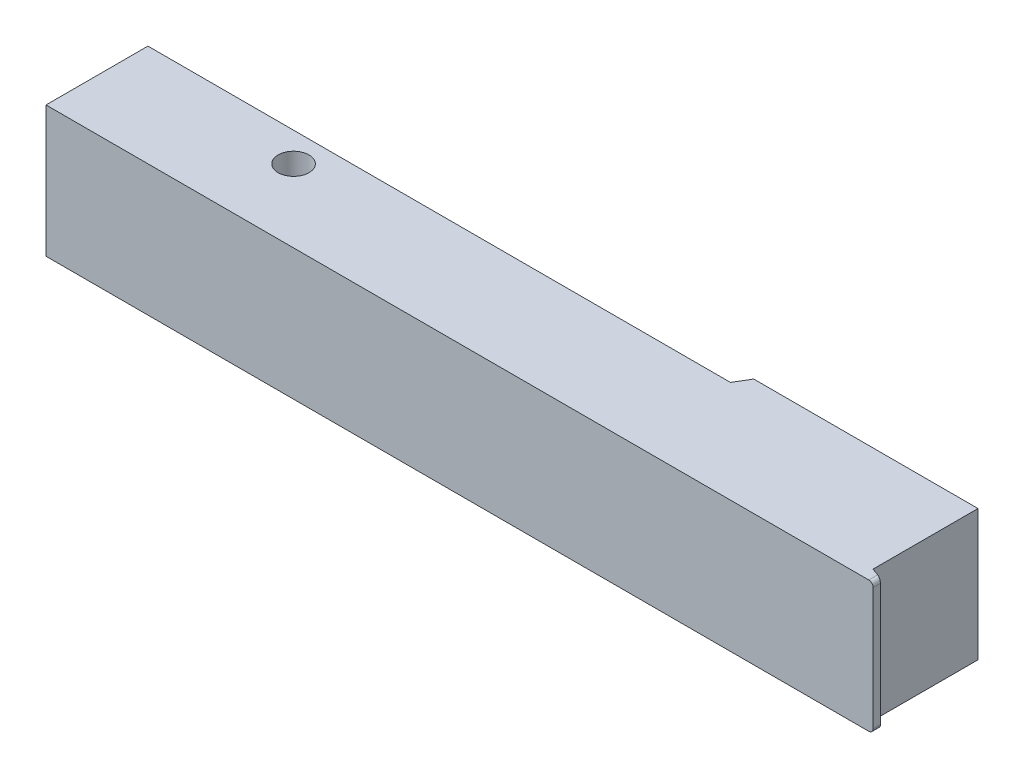
ISO-10303-21;
HEADER;
FILE_DESCRIPTION(('STEP AP214'),'2;1');
FILE_NAME('part.step','',(''),(''),'','','');
FILE_SCHEMA(('AUTOMOTIVE_DESIGN { 1 0 10303 214 1 1 1 1 }'));
ENDSEC;
DATA;
#1=APPLICATION_CONTEXT('core data for automotive mechanical design processes');
#2=APPLICATION_PROTOCOL_DEFINITION('international standard','automotive_design',2000,#1);
#3=PRODUCT_CONTEXT('',#1,'mechanical');
#4=PRODUCT('Part','Part','',(#3));
#5=PRODUCT_RELATED_PRODUCT_CATEGORY('part','',(#4));
#6=PRODUCT_DEFINITION_FORMATION('','',#4);
#7=PRODUCT_DEFINITION_CONTEXT('part definition',#1,'design');
#8=PRODUCT_DEFINITION('design','',#6,#7);
#9=PRODUCT_DEFINITION_SHAPE('','',#8);
#10=(LENGTH_UNIT() NAMED_UNIT(*) SI_UNIT(.MILLI.,.METRE.));
#11=(NAMED_UNIT(*) PLANE_ANGLE_UNIT() SI_UNIT($,.RADIAN.));
#12=(NAMED_UNIT(*) SI_UNIT($,.STERADIAN.) SOLID_ANGLE_UNIT());
#13=UNCERTAINTY_MEASURE_WITH_UNIT(LENGTH_MEASURE(1.E-05),#10,'distance_accuracy_value','');
#14=(GEOMETRIC_REPRESENTATION_CONTEXT(3) GLOBAL_UNCERTAINTY_ASSIGNED_CONTEXT((#13)) GLOBAL_UNIT_ASSIGNED_CONTEXT((#10,
#11,#12)) REPRESENTATION_CONTEXT('',''));
#15=CARTESIAN_POINT('',(0.,0.,0.));
#16=DIRECTION('',(0.,0.,1.));
#17=DIRECTION('',(1.,0.,0.));
#18=AXIS2_PLACEMENT_3D('',#15,#16,#17);
#19=CARTESIAN_POINT('',(0.,22.5,-20.));
#20=DIRECTION('',(0.,-1.,0.));
#21=DIRECTION('',(1.,0.,0.));
#22=AXIS2_PLACEMENT_3D('',#19,#20,#21);
#23=PLANE('',#22);
#24=CARTESIAN_POINT('',(30.,22.5,-12.5));
#25=DIRECTION('',(0.,1.,0.));
#26=DIRECTION('',(-1.,0.,0.));
#27=AXIS2_PLACEMENT_3D('',#24,#25,#26);
#28=CIRCLE('',#27,2.65);
#29=CARTESIAN_POINT('',(27.35,22.5,-12.5));
#30=VERTEX_POINT('',#29);
#31=EDGE_CURVE('E139',#30,#30,#28,.T.);
#32=ORIENTED_EDGE('',*,*,#31,.F.);
#33=EDGE_LOOP('',(#32));
#34=FACE_BOUND('',#33,.T.);
#35=DIRECTION('',(-0.514495755427527,0.,0.857492925712544));
#36=VECTOR('',#35,1.);
#37=CARTESIAN_POINT('',(74.6323529411764,22.5,24.7794117647059));
#38=LINE('',#37,#36);
#39=CARTESIAN_POINT('',(101.5,22.5,-20.));
#40=VERTEX_POINT('',#39);
#41=CARTESIAN_POINT('',(100.,22.5,-17.5));
#42=VERTEX_POINT('',#41);
#43=EDGE_CURVE('E59',#40,#42,#38,.T.);
#44=ORIENTED_EDGE('',*,*,#43,.T.);
#45=DIRECTION('',(-1.,0.,0.));
#46=VECTOR('',#45,1.);
#47=CARTESIAN_POINT('',(0.,22.5,-17.5));
#48=LINE('',#47,#46);
#49=CARTESIAN_POINT('',(0.,22.5,-17.5));
#50=VERTEX_POINT('',#49);
#51=EDGE_CURVE('E126',#42,#50,#48,.T.);
#52=ORIENTED_EDGE('',*,*,#51,.T.);
#53=DIRECTION('',(0.,0.,1.));
#54=VECTOR('',#53,1.);
#55=CARTESIAN_POINT('',(0.,22.5,-20.));
#56=LINE('',#55,#54);
#57=CARTESIAN_POINT('',(0.,22.5,0.));
#58=VERTEX_POINT('',#57);
#59=EDGE_CURVE('E175',#50,#58,#56,.T.);
#60=ORIENTED_EDGE('',*,*,#59,.T.);
#61=DIRECTION('',(1.,0.,0.));
#62=VECTOR('',#61,1.);
#63=CARTESIAN_POINT('',(0.,22.5,0.));
#64=LINE('',#63,#62);
#65=CARTESIAN_POINT('',(141.25,22.5,0.));
#66=VERTEX_POINT('',#65);
#67=EDGE_CURVE('E167',#58,#66,#64,.T.);
#68=ORIENTED_EDGE('',*,*,#67,.T.);
#69=DIRECTION('',(0.,0.,1.));
#70=VECTOR('',#69,1.);
#71=CARTESIAN_POINT('',(141.25,22.5,-1.24999999999999));
#72=LINE('',#71,#70);
#73=CARTESIAN_POINT('',(141.25,22.5,-1.52297767569964));
#74=VERTEX_POINT('',#73);
#75=EDGE_CURVE('E11',#66,#74,#72,.F.);
#76=ORIENTED_EDGE('',*,*,#75,.T.);
#77=DIRECTION('',(0.939692620785909,0.,0.342020143325667));
#78=VECTOR('',#77,1.);
#79=CARTESIAN_POINT('',(142.,22.5,-1.24999999999999));
#80=LINE('',#79,#78);
#81=CARTESIAN_POINT('',(140.,22.5,-1.97794046853239));
#82=VERTEX_POINT('',#81);
#83=EDGE_CURVE('E180',#74,#82,#80,.F.);
#84=ORIENTED_EDGE('',*,*,#83,.T.);
#85=DIRECTION('',(0.,0.,1.));
#86=VECTOR('',#85,1.);
#87=CARTESIAN_POINT('',(140.,22.5,-20.));
#88=LINE('',#87,#86);
#89=CARTESIAN_POINT('',(140.,22.5,-20.));
#90=VERTEX_POINT('',#89);
#91=EDGE_CURVE('E153',#90,#82,#88,.T.);
#92=ORIENTED_EDGE('',*,*,#91,.F.);
#93=DIRECTION('',(1.,0.,0.));
#94=VECTOR('',#93,1.);
#95=CARTESIAN_POINT('',(0.,22.5,-20.));
#96=LINE('',#95,#94);
#97=EDGE_CURVE('E160',#40,#90,#96,.T.);
#98=ORIENTED_EDGE('',*,*,#97,.F.);
#99=EDGE_LOOP('',(#44,#52,#60,#68,#76,#84,#92,#98));
#100=FACE_BOUND('',#99,.T.);
#101=ADVANCED_FACE('F44',(#34,#100),#23,.F.);
#102=CARTESIAN_POINT('',(142.,0.,-20.));
#103=DIRECTION('',(1.,0.,0.));
#104=DIRECTION('',(0.,0.,-1.));
#105=AXIS2_PLACEMENT_3D('',#102,#103,#104);
#106=PLANE('',#105);
#107=DIRECTION('',(0.,1.,0.));
#108=VECTOR('',#107,1.);
#109=CARTESIAN_POINT('',(142.,0.,0.));
#110=LINE('',#109,#108);
#111=CARTESIAN_POINT('',(142.,0.750000000000017,0.));
#112=VERTEX_POINT('',#111);
#113=CARTESIAN_POINT('',(142.,21.75,0.));
#114=VERTEX_POINT('',#113);
#115=EDGE_CURVE('E169',#112,#114,#110,.T.);
#116=ORIENTED_EDGE('',*,*,#115,.F.);
#117=DIRECTION('',(0.,0.,1.));
#118=VECTOR('',#117,1.);
#119=CARTESIAN_POINT('',(142.,0.750000000000017,-20.));
#120=LINE('',#119,#118);
#121=CARTESIAN_POINT('',(142.,0.750000000000017,-1.24999999999999));
#122=VERTEX_POINT('',#121);
#123=EDGE_CURVE('E198',#112,#122,#120,.F.);
#124=ORIENTED_EDGE('',*,*,#123,.T.);
#125=DIRECTION('',(0.,1.,0.));
#126=VECTOR('',#125,1.);
#127=CARTESIAN_POINT('',(142.,0.,-1.24999999999999));
#128=LINE('',#127,#126);
#129=CARTESIAN_POINT('',(142.,21.75,-1.24999999999999));
#130=VERTEX_POINT('',#129);
#131=EDGE_CURVE('E177',#122,#130,#128,.T.);
#132=ORIENTED_EDGE('',*,*,#131,.T.);
#133=DIRECTION('',(0.,0.,1.));
#134=VECTOR('',#133,1.);
#135=CARTESIAN_POINT('',(142.,21.75,0.));
#136=LINE('',#135,#134);
#137=EDGE_CURVE('E195',#130,#114,#136,.T.);
#138=ORIENTED_EDGE('',*,*,#137,.T.);
#139=EDGE_LOOP('',(#116,#124,#132,#138));
#140=FACE_BOUND('',#139,.T.);
#141=ADVANCED_FACE('F217',(#140),#106,.T.);
#142=CARTESIAN_POINT('',(0.,0.,-20.));
#143=DIRECTION('',(0.,-1.,0.));
#144=DIRECTION('',(1.,0.,0.));
#145=AXIS2_PLACEMENT_3D('',#142,#143,#144);
#146=PLANE('',#145);
#147=CARTESIAN_POINT('',(30.,0.,-12.5));
#148=DIRECTION('',(0.,-1.,0.));
#149=DIRECTION('',(1.,0.,0.));
#150=AXIS2_PLACEMENT_3D('',#147,#148,#149);
#151=CIRCLE('',#150,2.65);
#152=CARTESIAN_POINT('',(32.65,0.,-12.5));
#153=VERTEX_POINT('',#152);
#154=EDGE_CURVE('E142',#153,#153,#151,.F.);
#155=ORIENTED_EDGE('',*,*,#154,.T.);
#156=EDGE_LOOP('',(#155));
#157=FACE_BOUND('',#156,.T.);
#158=DIRECTION('',(1.,0.,0.));
#159=VECTOR('',#158,1.);
#160=CARTESIAN_POINT('',(100.,0.,-17.5));
#161=LINE('',#160,#159);
#162=CARTESIAN_POINT('',(0.,0.,-17.5));
#163=VERTEX_POINT('',#162);
#164=CARTESIAN_POINT('',(100.,0.,-17.5));
#165=VERTEX_POINT('',#164);
#166=EDGE_CURVE('E123',#163,#165,#161,.T.);
#167=ORIENTED_EDGE('',*,*,#166,.T.);
#168=DIRECTION('',(0.514495755427527,0.,-0.857492925712544));
#169=VECTOR('',#168,1.);
#170=CARTESIAN_POINT('',(100.,0.,-17.5));
#171=LINE('',#170,#169);
#172=CARTESIAN_POINT('',(101.5,0.,-20.));
#173=VERTEX_POINT('',#172);
#174=EDGE_CURVE('E128',#165,#173,#171,.T.);
#175=ORIENTED_EDGE('',*,*,#174,.T.);
#176=DIRECTION('',(1.,0.,0.));
#177=VECTOR('',#176,1.);
#178=CARTESIAN_POINT('',(0.,0.,-20.));
#179=LINE('',#178,#177);
#180=CARTESIAN_POINT('',(140.,0.,-20.));
#181=VERTEX_POINT('',#180);
#182=EDGE_CURVE('E162',#173,#181,#179,.T.);
#183=ORIENTED_EDGE('',*,*,#182,.T.);
#184=DIRECTION('',(0.,0.,1.));
#185=VECTOR('',#184,1.);
#186=CARTESIAN_POINT('',(140.,0.,-20.));
#187=LINE('',#186,#185);
#188=CARTESIAN_POINT('',(140.,0.,-1.97794046853239));
#189=VERTEX_POINT('',#188);
#190=EDGE_CURVE('E151',#181,#189,#187,.T.);
#191=ORIENTED_EDGE('',*,*,#190,.T.);
#192=DIRECTION('',(-0.939692620785909,0.,-0.342020143325667));
#193=VECTOR('',#192,1.);
#194=CARTESIAN_POINT('',(10.5847106977411,0.,-49.0812536335036));
#195=LINE('',#194,#193);
#196=CARTESIAN_POINT('',(141.25,0.,-1.52297767569964));
#197=VERTEX_POINT('',#196);
#198=EDGE_CURVE('E182',#189,#197,#195,.F.);
#199=ORIENTED_EDGE('',*,*,#198,.T.);
#200=DIRECTION('',(0.,0.,1.));
#201=VECTOR('',#200,1.);
#202=CARTESIAN_POINT('',(141.25,0.,-20.));
#203=LINE('',#202,#201);
#204=CARTESIAN_POINT('',(141.25,0.,0.));
#205=VERTEX_POINT('',#204);
#206=EDGE_CURVE('E188',#197,#205,#203,.T.);
#207=ORIENTED_EDGE('',*,*,#206,.T.);
#208=DIRECTION('',(1.,0.,0.));
#209=VECTOR('',#208,1.);
#210=CARTESIAN_POINT('',(0.,0.,0.));
#211=LINE('',#210,#209);
#212=CARTESIAN_POINT('',(0.,0.,0.));
#213=VERTEX_POINT('',#212);
#214=EDGE_CURVE('E163',#213,#205,#211,.T.);
#215=ORIENTED_EDGE('',*,*,#214,.F.);
#216=DIRECTION('',(0.,0.,1.));
#217=VECTOR('',#216,1.);
#218=CARTESIAN_POINT('',(0.,0.,-20.));
#219=LINE('',#218,#217);
#220=EDGE_CURVE('E138',#163,#213,#219,.T.);
#221=ORIENTED_EDGE('',*,*,#220,.F.);
#222=EDGE_LOOP('',(#167,#175,#183,#191,#199,#207,#215,#221));
#223=FACE_BOUND('',#222,.T.);
#224=ADVANCED_FACE('F136',(#157,#223),#146,.T.);
#225=CARTESIAN_POINT('',(0.,0.,-20.));
#226=DIRECTION('',(1.,0.,0.));
#227=DIRECTION('',(0.,0.,-1.));
#228=AXIS2_PLACEMENT_3D('',#225,#226,#227);
#229=PLANE('',#228);
#230=ORIENTED_EDGE('',*,*,#59,.F.);
#231=DIRECTION('',(0.,1.,0.));
#232=VECTOR('',#231,1.);
#233=CARTESIAN_POINT('',(0.,0.,-17.5));
#234=LINE('',#233,#232);
#235=EDGE_CURVE('E146',#163,#50,#234,.T.);
#236=ORIENTED_EDGE('',*,*,#235,.F.);
#237=ORIENTED_EDGE('',*,*,#220,.T.);
#238=DIRECTION('',(0.,1.,0.));
#239=VECTOR('',#238,1.);
#240=CARTESIAN_POINT('',(0.,0.,0.));
#241=LINE('',#240,#239);
#242=EDGE_CURVE('E159',#213,#58,#241,.T.);
#243=ORIENTED_EDGE('',*,*,#242,.T.);
#244=EDGE_LOOP('',(#230,#236,#237,#243));
#245=FACE_BOUND('',#244,.T.);
#246=ADVANCED_FACE('F224',(#245),#229,.F.);
#247=CARTESIAN_POINT('',(0.,0.,-20.));
#248=DIRECTION('',(0.,0.,-1.));
#249=DIRECTION('',(-1.,0.,0.));
#250=AXIS2_PLACEMENT_3D('',#247,#248,#249);
#251=PLANE('',#250);
#252=DIRECTION('',(0.,1.,0.));
#253=VECTOR('',#252,1.);
#254=CARTESIAN_POINT('',(101.5,0.,-20.));
#255=LINE('',#254,#253);
#256=EDGE_CURVE('E127',#173,#40,#255,.T.);
#257=ORIENTED_EDGE('',*,*,#256,.T.);
#258=ORIENTED_EDGE('',*,*,#97,.T.);
#259=DIRECTION('',(0.,1.,0.));
#260=VECTOR('',#259,1.);
#261=CARTESIAN_POINT('',(140.,0.,-20.));
#262=LINE('',#261,#260);
#263=EDGE_CURVE('E156',#181,#90,#262,.T.);
#264=ORIENTED_EDGE('',*,*,#263,.F.);
#265=ORIENTED_EDGE('',*,*,#182,.F.);
#266=EDGE_LOOP('',(#257,#258,#264,#265));
#267=FACE_BOUND('',#266,.T.);
#268=ADVANCED_FACE('F226',(#267),#251,.T.);
#269=CARTESIAN_POINT('',(0.,0.,0.));
#270=DIRECTION('',(0.,0.,-1.));
#271=DIRECTION('',(-1.,0.,0.));
#272=AXIS2_PLACEMENT_3D('',#269,#270,#271);
#273=PLANE('',#272);
#274=ORIENTED_EDGE('',*,*,#214,.T.);
#275=CARTESIAN_POINT('',(141.25,0.750000000000017,0.));
#276=DIRECTION('',(0.,0.,-1.));
#277=DIRECTION('',(-1.,0.,0.));
#278=AXIS2_PLACEMENT_3D('',#275,#276,#277);
#279=CIRCLE('',#278,0.75);
#280=EDGE_CURVE('E193',#205,#112,#279,.F.);
#281=ORIENTED_EDGE('',*,*,#280,.T.);
#282=ORIENTED_EDGE('',*,*,#115,.T.);
#283=CARTESIAN_POINT('',(141.25,21.75,0.));
#284=DIRECTION('',(0.,0.,-1.));
#285=DIRECTION('',(-1.,0.,0.));
#286=AXIS2_PLACEMENT_3D('',#283,#284,#285);
#287=CIRCLE('',#286,0.75);
#288=EDGE_CURVE('E191',#114,#66,#287,.F.);
#289=ORIENTED_EDGE('',*,*,#288,.T.);
#290=ORIENTED_EDGE('',*,*,#67,.F.);
#291=ORIENTED_EDGE('',*,*,#242,.F.);
#292=EDGE_LOOP('',(#274,#281,#282,#289,#290,#291));
#293=FACE_BOUND('',#292,.T.);
#294=ADVANCED_FACE('F214',(#293),#273,.F.);
#295=CARTESIAN_POINT('',(140.,0.,0.));
#296=DIRECTION('',(-1.,0.,0.));
#297=DIRECTION('',(0.,0.,1.));
#298=AXIS2_PLACEMENT_3D('',#295,#296,#297);
#299=PLANE('',#298);
#300=ORIENTED_EDGE('',*,*,#190,.F.);
#301=ORIENTED_EDGE('',*,*,#263,.T.);
#302=ORIENTED_EDGE('',*,*,#91,.T.);
#303=DIRECTION('',(0.,1.,0.));
#304=VECTOR('',#303,1.);
#305=CARTESIAN_POINT('',(140.,0.,-1.97794046853239));
#306=LINE('',#305,#304);
#307=EDGE_CURVE('E185',#82,#189,#306,.F.);
#308=ORIENTED_EDGE('',*,*,#307,.T.);
#309=EDGE_LOOP('',(#300,#301,#302,#308));
#310=FACE_BOUND('',#309,.T.);
#311=ADVANCED_FACE('F250',(#310),#299,.F.);
#312=CARTESIAN_POINT('',(142.,0.,-1.24999999999999));
#313=DIRECTION('',(-0.342020143325667,0.,0.939692620785909));
#314=DIRECTION('',(0.,1.,0.));
#315=AXIS2_PLACEMENT_3D('',#312,#313,#314);
#316=PLANE('',#315);
#317=ORIENTED_EDGE('',*,*,#131,.F.);
#318=CARTESIAN_POINT('',(141.25,0.750000000000017,-1.52297767569964));
#319=DIRECTION('',(-0.342020143325667,0.,0.939692620785909));
#320=DIRECTION('',(0.939692620785909,0.,0.342020143325667));
#321=AXIS2_PLACEMENT_3D('',#318,#319,#320);
#322=ELLIPSE('',#321,0.798133329356934,0.75);
#323=EDGE_CURVE('E52',#122,#197,#322,.F.);
#324=ORIENTED_EDGE('',*,*,#323,.T.);
#325=ORIENTED_EDGE('',*,*,#198,.F.);
#326=ORIENTED_EDGE('',*,*,#307,.F.);
#327=ORIENTED_EDGE('',*,*,#83,.F.);
#328=CARTESIAN_POINT('',(141.25,21.75,-1.52297767569964));
#329=DIRECTION('',(-0.342020143325667,0.,0.939692620785909));
#330=DIRECTION('',(-0.939692620785909,0.,-0.342020143325667));
#331=AXIS2_PLACEMENT_3D('',#328,#329,#330);
#332=ELLIPSE('',#331,0.798133329356934,0.75);
#333=EDGE_CURVE('E200',#74,#130,#332,.F.);
#334=ORIENTED_EDGE('',*,*,#333,.T.);
#335=EDGE_LOOP('',(#317,#324,#325,#326,#327,#334));
#336=FACE_BOUND('',#335,.T.);
#337=ADVANCED_FACE('F205',(#336),#316,.F.);
#338=CARTESIAN_POINT('',(141.25,0.750000000000017,-20.));
#339=DIRECTION('',(0.,0.,1.));
#340=DIRECTION('',(1.,0.,0.));
#341=AXIS2_PLACEMENT_3D('',#338,#339,#340);
#342=CYLINDRICAL_SURFACE('',#341,0.75);
#343=ORIENTED_EDGE('',*,*,#323,.F.);
#344=ORIENTED_EDGE('',*,*,#123,.F.);
#345=ORIENTED_EDGE('',*,*,#280,.F.);
#346=ORIENTED_EDGE('',*,*,#206,.F.);
#347=EDGE_LOOP('',(#343,#344,#345,#346));
#348=FACE_BOUND('',#347,.T.);
#349=ADVANCED_FACE('F211',(#348),#342,.T.);
#350=CARTESIAN_POINT('',(141.25,21.75,-20.));
#351=DIRECTION('',(0.,0.,-1.));
#352=DIRECTION('',(-1.,0.,0.));
#353=AXIS2_PLACEMENT_3D('',#350,#351,#352);
#354=CYLINDRICAL_SURFACE('',#353,0.75);
#355=ORIENTED_EDGE('',*,*,#333,.F.);
#356=ORIENTED_EDGE('',*,*,#75,.F.);
#357=ORIENTED_EDGE('',*,*,#288,.F.);
#358=ORIENTED_EDGE('',*,*,#137,.F.);
#359=EDGE_LOOP('',(#355,#356,#357,#358));
#360=FACE_BOUND('',#359,.T.);
#361=ADVANCED_FACE('F46',(#360),#354,.T.);
#362=CARTESIAN_POINT('',(100.,0.,-17.5));
#363=DIRECTION('',(0.,0.,1.));
#364=DIRECTION('',(1.,0.,0.));
#365=AXIS2_PLACEMENT_3D('',#362,#363,#364);
#366=PLANE('',#365);
#367=DIRECTION('',(0.,1.,0.));
#368=VECTOR('',#367,1.);
#369=CARTESIAN_POINT('',(100.,0.,-17.5));
#370=LINE('',#369,#368);
#371=EDGE_CURVE('E119',#165,#42,#370,.T.);
#372=ORIENTED_EDGE('',*,*,#371,.F.);
#373=ORIENTED_EDGE('',*,*,#166,.F.);
#374=ORIENTED_EDGE('',*,*,#235,.T.);
#375=ORIENTED_EDGE('',*,*,#51,.F.);
#376=EDGE_LOOP('',(#372,#373,#374,#375));
#377=FACE_BOUND('',#376,.T.);
#378=ADVANCED_FACE('F121',(#377),#366,.F.);
#379=CARTESIAN_POINT('',(100.,0.,-17.5));
#380=DIRECTION('',(0.857492925712544,0.,0.514495755427527));
#381=DIRECTION('',(0.514495755427527,0.,-0.857492925712544));
#382=AXIS2_PLACEMENT_3D('',#379,#380,#381);
#383=PLANE('',#382);
#384=ORIENTED_EDGE('',*,*,#256,.F.);
#385=ORIENTED_EDGE('',*,*,#174,.F.);
#386=ORIENTED_EDGE('',*,*,#371,.T.);
#387=ORIENTED_EDGE('',*,*,#43,.F.);
#388=EDGE_LOOP('',(#384,#385,#386,#387));
#389=FACE_BOUND('',#388,.T.);
#390=ADVANCED_FACE('F131',(#389),#383,.F.);
#391=CARTESIAN_POINT('',(30.,-0.00100000000003223,-12.5));
#392=DIRECTION('',(0.,1.,0.));
#393=DIRECTION('',(-1.,0.,0.));
#394=AXIS2_PLACEMENT_3D('',#391,#392,#393);
#395=CYLINDRICAL_SURFACE('',#394,2.65);
#396=ORIENTED_EDGE('',*,*,#154,.F.);
#397=EDGE_LOOP('',(#396));
#398=FACE_BOUND('',#397,.T.);
#399=ORIENTED_EDGE('',*,*,#31,.T.);
#400=EDGE_LOOP('',(#399));
#401=FACE_BOUND('',#400,.T.);
#402=ADVANCED_FACE('F259',(#398,#401),#395,.F.);
#403=CLOSED_SHELL('',(#101,#141,#224,#246,#268,#294,#311,#337,#349,#361,#378,#390,#402));
#404=MANIFOLD_SOLID_BREP('B2',#403);
#405=ADVANCED_BREP_SHAPE_REPRESENTATION('',(#18,#404),#14);
#406=SHAPE_DEFINITION_REPRESENTATION(#9,#405);
ENDSEC;
END-ISO-10303-21;
